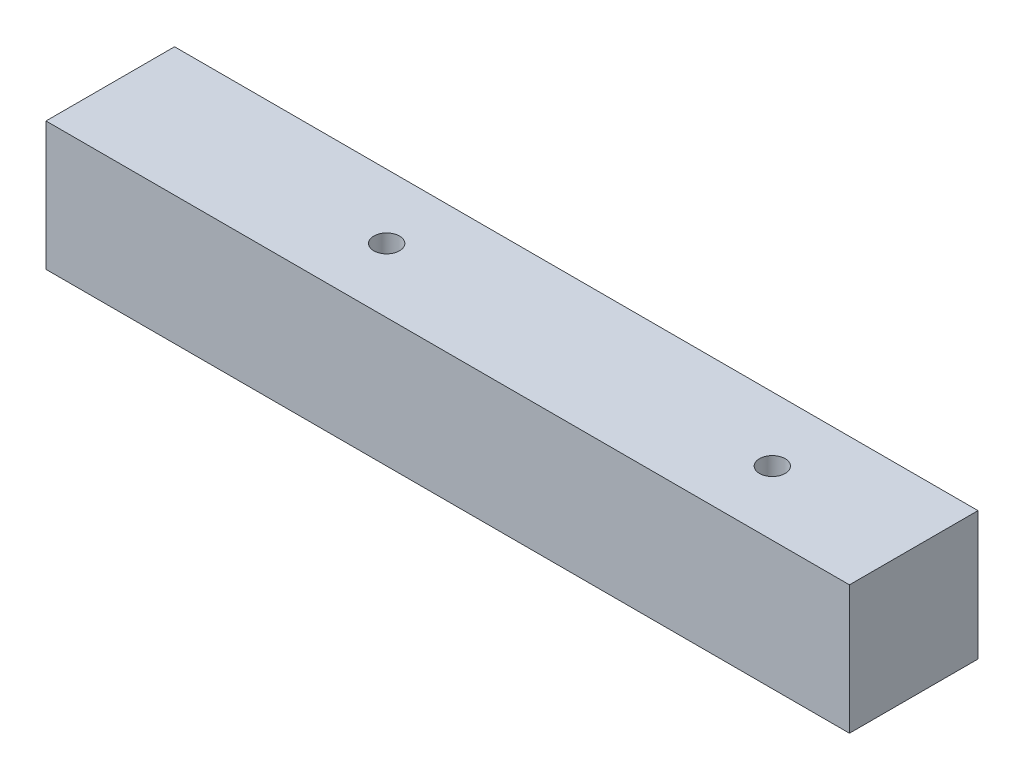
ISO-10303-21;
HEADER;
FILE_DESCRIPTION(('STEP AP214'),'2;1');
FILE_NAME('part.step','',(''),(''),'','','');
FILE_SCHEMA(('AUTOMOTIVE_DESIGN { 1 0 10303 214 1 1 1 1 }'));
ENDSEC;
DATA;
#1=APPLICATION_CONTEXT('core data for automotive mechanical design processes');
#2=APPLICATION_PROTOCOL_DEFINITION('international standard','automotive_design',2000,#1);
#3=PRODUCT_CONTEXT('',#1,'mechanical');
#4=PRODUCT('Part','Part','',(#3));
#5=PRODUCT_RELATED_PRODUCT_CATEGORY('part','',(#4));
#6=PRODUCT_DEFINITION_FORMATION('','',#4);
#7=PRODUCT_DEFINITION_CONTEXT('part definition',#1,'design');
#8=PRODUCT_DEFINITION('design','',#6,#7);
#9=PRODUCT_DEFINITION_SHAPE('','',#8);
#10=(LENGTH_UNIT() NAMED_UNIT(*) SI_UNIT(.MILLI.,.METRE.));
#11=(NAMED_UNIT(*) PLANE_ANGLE_UNIT() SI_UNIT($,.RADIAN.));
#12=(NAMED_UNIT(*) SI_UNIT($,.STERADIAN.) SOLID_ANGLE_UNIT());
#13=UNCERTAINTY_MEASURE_WITH_UNIT(LENGTH_MEASURE(1.E-05),#10,'distance_accuracy_value','');
#14=(GEOMETRIC_REPRESENTATION_CONTEXT(3) GLOBAL_UNCERTAINTY_ASSIGNED_CONTEXT((#13)) GLOBAL_UNIT_ASSIGNED_CONTEXT((#10,
#11,#12)) REPRESENTATION_CONTEXT('',''));
#15=CARTESIAN_POINT('',(0.,0.,0.));
#16=DIRECTION('',(0.,0.,1.));
#17=DIRECTION('',(1.,0.,0.));
#18=AXIS2_PLACEMENT_3D('',#15,#16,#17);
#19=CARTESIAN_POINT('',(0.,20.,0.));
#20=DIRECTION('',(1.,0.,0.));
#21=DIRECTION('',(0.,0.,-1.));
#22=AXIS2_PLACEMENT_3D('',#19,#20,#21);
#23=PLANE('',#22);
#24=DIRECTION('',(0.,0.,1.));
#25=VECTOR('',#24,1.);
#26=CARTESIAN_POINT('',(0.,0.,0.));
#27=LINE('',#26,#25);
#28=CARTESIAN_POINT('',(0.,0.,-20.));
#29=VERTEX_POINT('',#28);
#30=CARTESIAN_POINT('',(0.,0.,0.));
#31=VERTEX_POINT('',#30);
#32=EDGE_CURVE('E98',#29,#31,#27,.T.);
#33=ORIENTED_EDGE('',*,*,#32,.T.);
#34=DIRECTION('',(0.,-1.,0.));
#35=VECTOR('',#34,1.);
#36=CARTESIAN_POINT('',(0.,20.,0.));
#37=LINE('',#36,#35);
#38=CARTESIAN_POINT('',(0.,20.,0.));
#39=VERTEX_POINT('',#38);
#40=EDGE_CURVE('E11',#39,#31,#37,.T.);
#41=ORIENTED_EDGE('',*,*,#40,.F.);
#42=DIRECTION('',(0.,0.,1.));
#43=VECTOR('',#42,1.);
#44=CARTESIAN_POINT('',(0.,20.,0.));
#45=LINE('',#44,#43);
#46=CARTESIAN_POINT('',(0.,20.,-20.));
#47=VERTEX_POINT('',#46);
#48=EDGE_CURVE('E86',#47,#39,#45,.T.);
#49=ORIENTED_EDGE('',*,*,#48,.F.);
#50=DIRECTION('',(0.,-1.,0.));
#51=VECTOR('',#50,1.);
#52=CARTESIAN_POINT('',(0.,20.,-20.));
#53=LINE('',#52,#51);
#54=EDGE_CURVE('E94',#47,#29,#53,.T.);
#55=ORIENTED_EDGE('',*,*,#54,.T.);
#56=EDGE_LOOP('',(#33,#41,#49,#55));
#57=FACE_BOUND('',#56,.T.);
#58=ADVANCED_FACE('F35',(#57),#23,.F.);
#59=CARTESIAN_POINT('',(0.,20.,0.));
#60=DIRECTION('',(0.,0.,-1.));
#61=DIRECTION('',(-1.,0.,0.));
#62=AXIS2_PLACEMENT_3D('',#59,#60,#61);
#63=PLANE('',#62);
#64=DIRECTION('',(1.,0.,0.));
#65=VECTOR('',#64,1.);
#66=CARTESIAN_POINT('',(0.,0.,0.));
#67=LINE('',#66,#65);
#68=CARTESIAN_POINT('',(125.,0.,0.));
#69=VERTEX_POINT('',#68);
#70=EDGE_CURVE('E90',#31,#69,#67,.T.);
#71=ORIENTED_EDGE('',*,*,#70,.T.);
#72=DIRECTION('',(0.,-1.,0.));
#73=VECTOR('',#72,1.);
#74=CARTESIAN_POINT('',(125.,20.,0.));
#75=LINE('',#74,#73);
#76=CARTESIAN_POINT('',(125.,20.,0.));
#77=VERTEX_POINT('',#76);
#78=EDGE_CURVE('E43',#77,#69,#75,.T.);
#79=ORIENTED_EDGE('',*,*,#78,.F.);
#80=DIRECTION('',(1.,0.,0.));
#81=VECTOR('',#80,1.);
#82=CARTESIAN_POINT('',(0.,20.,0.));
#83=LINE('',#82,#81);
#84=EDGE_CURVE('E81',#39,#77,#83,.T.);
#85=ORIENTED_EDGE('',*,*,#84,.F.);
#86=ORIENTED_EDGE('',*,*,#40,.T.);
#87=EDGE_LOOP('',(#71,#79,#85,#86));
#88=FACE_BOUND('',#87,.T.);
#89=ADVANCED_FACE('F89',(#88),#63,.F.);
#90=CARTESIAN_POINT('',(125.,20.,0.));
#91=DIRECTION('',(-1.,0.,0.));
#92=DIRECTION('',(0.,0.,1.));
#93=AXIS2_PLACEMENT_3D('',#90,#91,#92);
#94=PLANE('',#93);
#95=DIRECTION('',(0.,0.,-1.));
#96=VECTOR('',#95,1.);
#97=CARTESIAN_POINT('',(125.,0.,0.));
#98=LINE('',#97,#96);
#99=CARTESIAN_POINT('',(125.,0.,-20.));
#100=VERTEX_POINT('',#99);
#101=EDGE_CURVE('E68',#69,#100,#98,.T.);
#102=ORIENTED_EDGE('',*,*,#101,.T.);
#103=DIRECTION('',(0.,-1.,0.));
#104=VECTOR('',#103,1.);
#105=CARTESIAN_POINT('',(125.,20.,-20.));
#106=LINE('',#105,#104);
#107=CARTESIAN_POINT('',(125.,20.,-20.));
#108=VERTEX_POINT('',#107);
#109=EDGE_CURVE('E91',#108,#100,#106,.T.);
#110=ORIENTED_EDGE('',*,*,#109,.F.);
#111=DIRECTION('',(0.,0.,-1.));
#112=VECTOR('',#111,1.);
#113=CARTESIAN_POINT('',(125.,20.,0.));
#114=LINE('',#113,#112);
#115=EDGE_CURVE('E84',#77,#108,#114,.T.);
#116=ORIENTED_EDGE('',*,*,#115,.F.);
#117=ORIENTED_EDGE('',*,*,#78,.T.);
#118=EDGE_LOOP('',(#102,#110,#116,#117));
#119=FACE_BOUND('',#118,.T.);
#120=ADVANCED_FACE('F92',(#119),#94,.F.);
#121=CARTESIAN_POINT('',(0.,20.,-20.));
#122=DIRECTION('',(0.,0.,1.));
#123=DIRECTION('',(1.,0.,0.));
#124=AXIS2_PLACEMENT_3D('',#121,#122,#123);
#125=PLANE('',#124);
#126=DIRECTION('',(-1.,0.,0.));
#127=VECTOR('',#126,1.);
#128=CARTESIAN_POINT('',(0.,0.,-20.));
#129=LINE('',#128,#127);
#130=EDGE_CURVE('E74',#100,#29,#129,.T.);
#131=ORIENTED_EDGE('',*,*,#130,.T.);
#132=ORIENTED_EDGE('',*,*,#54,.F.);
#133=DIRECTION('',(-1.,0.,0.));
#134=VECTOR('',#133,1.);
#135=CARTESIAN_POINT('',(0.,20.,-20.));
#136=LINE('',#135,#134);
#137=EDGE_CURVE('E51',#108,#47,#136,.T.);
#138=ORIENTED_EDGE('',*,*,#137,.F.);
#139=ORIENTED_EDGE('',*,*,#109,.T.);
#140=EDGE_LOOP('',(#131,#132,#138,#139));
#141=FACE_BOUND('',#140,.T.);
#142=ADVANCED_FACE('F106',(#141),#125,.F.);
#143=CARTESIAN_POINT('',(0.,20.,0.));
#144=DIRECTION('',(0.,-1.,0.));
#145=DIRECTION('',(0.,0.,-1.));
#146=AXIS2_PLACEMENT_3D('',#143,#144,#145);
#147=PLANE('',#146);
#148=CARTESIAN_POINT('',(103.,20.,-10.));
#149=DIRECTION('',(0.,1.,0.));
#150=DIRECTION('',(0.,0.,1.));
#151=AXIS2_PLACEMENT_3D('',#148,#149,#150);
#152=CIRCLE('',#151,1.99999999999999);
#153=CARTESIAN_POINT('',(103.,20.,-8.00000000000001));
#154=VERTEX_POINT('',#153);
#155=EDGE_CURVE('E120',#154,#154,#152,.T.);
#156=ORIENTED_EDGE('',*,*,#155,.F.);
#157=EDGE_LOOP('',(#156));
#158=FACE_BOUND('',#157,.T.);
#159=CARTESIAN_POINT('',(43.,20.,-10.));
#160=DIRECTION('',(0.,1.,0.));
#161=DIRECTION('',(0.,0.,1.));
#162=AXIS2_PLACEMENT_3D('',#159,#160,#161);
#163=CIRCLE('',#162,1.99999999999999);
#164=CARTESIAN_POINT('',(43.,20.,-8.00000000000001));
#165=VERTEX_POINT('',#164);
#166=EDGE_CURVE('E114',#165,#165,#163,.T.);
#167=ORIENTED_EDGE('',*,*,#166,.F.);
#168=EDGE_LOOP('',(#167));
#169=FACE_BOUND('',#168,.T.);
#170=ORIENTED_EDGE('',*,*,#48,.T.);
#171=ORIENTED_EDGE('',*,*,#84,.T.);
#172=ORIENTED_EDGE('',*,*,#115,.T.);
#173=ORIENTED_EDGE('',*,*,#137,.T.);
#174=EDGE_LOOP('',(#170,#171,#172,#173));
#175=FACE_BOUND('',#174,.T.);
#176=ADVANCED_FACE('F82',(#158,#169,#175),#147,.F.);
#177=CARTESIAN_POINT('',(0.,0.,0.));
#178=DIRECTION('',(0.,-1.,0.));
#179=DIRECTION('',(0.,0.,-1.));
#180=AXIS2_PLACEMENT_3D('',#177,#178,#179);
#181=PLANE('',#180);
#182=CARTESIAN_POINT('',(103.,0.,-10.));
#183=DIRECTION('',(0.,1.,0.));
#184=DIRECTION('',(0.,0.,1.));
#185=AXIS2_PLACEMENT_3D('',#182,#183,#184);
#186=CIRCLE('',#185,2.);
#187=CARTESIAN_POINT('',(103.,0.,-8.));
#188=VERTEX_POINT('',#187);
#189=EDGE_CURVE('E117',#188,#188,#186,.T.);
#190=ORIENTED_EDGE('',*,*,#189,.T.);
#191=EDGE_LOOP('',(#190));
#192=FACE_BOUND('',#191,.T.);
#193=CARTESIAN_POINT('',(43.,0.,-10.));
#194=DIRECTION('',(0.,1.,0.));
#195=DIRECTION('',(0.,0.,1.));
#196=AXIS2_PLACEMENT_3D('',#193,#194,#195);
#197=CIRCLE('',#196,1.99999999999999);
#198=CARTESIAN_POINT('',(43.,0.,-8.00000000000001));
#199=VERTEX_POINT('',#198);
#200=EDGE_CURVE('E101',#199,#199,#197,.T.);
#201=ORIENTED_EDGE('',*,*,#200,.T.);
#202=EDGE_LOOP('',(#201));
#203=FACE_BOUND('',#202,.T.);
#204=ORIENTED_EDGE('',*,*,#32,.F.);
#205=ORIENTED_EDGE('',*,*,#130,.F.);
#206=ORIENTED_EDGE('',*,*,#101,.F.);
#207=ORIENTED_EDGE('',*,*,#70,.F.);
#208=EDGE_LOOP('',(#204,#205,#206,#207));
#209=FACE_BOUND('',#208,.T.);
#210=ADVANCED_FACE('F109',(#192,#203,#209),#181,.T.);
#211=CARTESIAN_POINT('',(43.,20.,-10.));
#212=DIRECTION('',(0.,1.,0.));
#213=DIRECTION('',(0.,0.,1.));
#214=AXIS2_PLACEMENT_3D('',#211,#212,#213);
#215=CYLINDRICAL_SURFACE('',#214,1.99999999999999);
#216=ORIENTED_EDGE('',*,*,#200,.F.);
#217=EDGE_LOOP('',(#216));
#218=FACE_BOUND('',#217,.T.);
#219=ORIENTED_EDGE('',*,*,#166,.T.);
#220=EDGE_LOOP('',(#219));
#221=FACE_BOUND('',#220,.T.);
#222=ADVANCED_FACE('F131',(#218,#221),#215,.F.);
#223=CARTESIAN_POINT('',(103.,20.,-10.));
#224=DIRECTION('',(0.,1.,0.));
#225=DIRECTION('',(0.,0.,1.));
#226=AXIS2_PLACEMENT_3D('',#223,#224,#225);
#227=CYLINDRICAL_SURFACE('',#226,1.99999999999999);
#228=ORIENTED_EDGE('',*,*,#189,.F.);
#229=EDGE_LOOP('',(#228));
#230=FACE_BOUND('',#229,.T.);
#231=ORIENTED_EDGE('',*,*,#155,.T.);
#232=EDGE_LOOP('',(#231));
#233=FACE_BOUND('',#232,.T.);
#234=ADVANCED_FACE('F124',(#230,#233),#227,.F.);
#235=CLOSED_SHELL('',(#58,#89,#120,#142,#176,#210,#222,#234));
#236=MANIFOLD_SOLID_BREP('B2',#235);
#237=ADVANCED_BREP_SHAPE_REPRESENTATION('',(#18,#236),#14);
#238=SHAPE_DEFINITION_REPRESENTATION(#9,#237);
ENDSEC;
END-ISO-10303-21;
